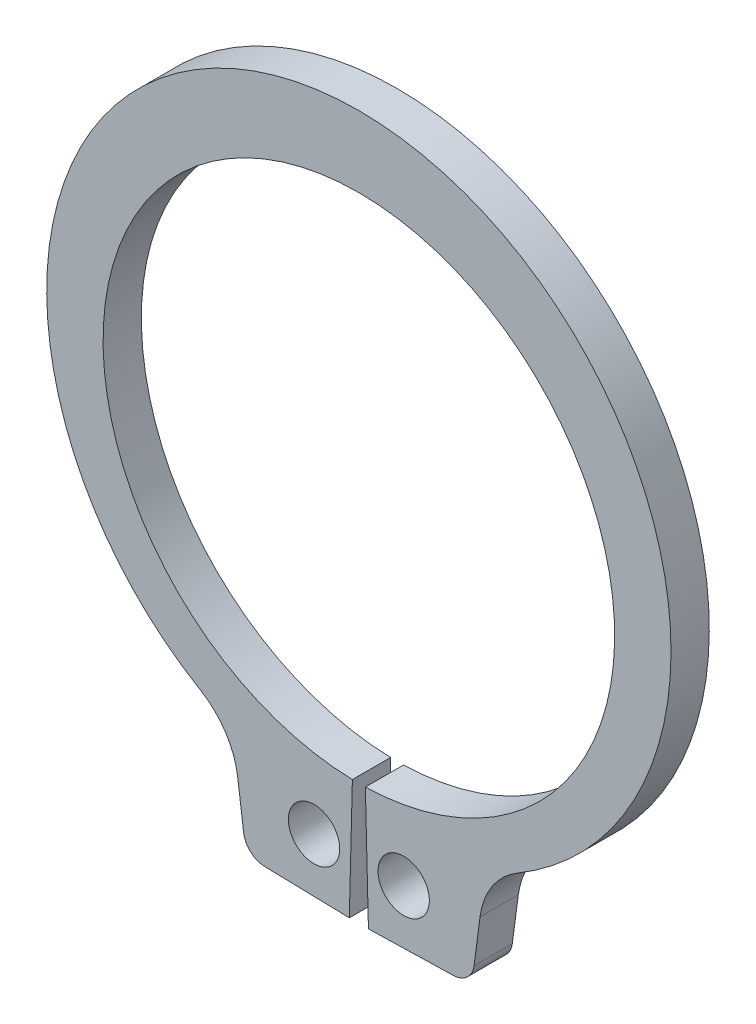
ISO-10303-21;
HEADER;
FILE_DESCRIPTION(('STEP AP214'),'2;1');
FILE_NAME('part.step','',(''),(''),'','','');
FILE_SCHEMA(('AUTOMOTIVE_DESIGN { 1 0 10303 214 1 1 1 1 }'));
ENDSEC;
DATA;
#1=APPLICATION_CONTEXT('core data for automotive mechanical design processes');
#2=APPLICATION_PROTOCOL_DEFINITION('international standard','automotive_design',2000,#1);
#3=PRODUCT_CONTEXT('',#1,'mechanical');
#4=PRODUCT('Part','Part','',(#3));
#5=PRODUCT_RELATED_PRODUCT_CATEGORY('part','',(#4));
#6=PRODUCT_DEFINITION_FORMATION('','',#4);
#7=PRODUCT_DEFINITION_CONTEXT('part definition',#1,'design');
#8=PRODUCT_DEFINITION('design','',#6,#7);
#9=PRODUCT_DEFINITION_SHAPE('','',#8);
#10=(LENGTH_UNIT() NAMED_UNIT(*) SI_UNIT(.MILLI.,.METRE.));
#11=(NAMED_UNIT(*) PLANE_ANGLE_UNIT() SI_UNIT($,.RADIAN.));
#12=(NAMED_UNIT(*) SI_UNIT($,.STERADIAN.) SOLID_ANGLE_UNIT());
#13=UNCERTAINTY_MEASURE_WITH_UNIT(LENGTH_MEASURE(1.E-05),#10,'distance_accuracy_value','');
#14=(GEOMETRIC_REPRESENTATION_CONTEXT(3) GLOBAL_UNCERTAINTY_ASSIGNED_CONTEXT((#13)) GLOBAL_UNIT_ASSIGNED_CONTEXT((#10,
#11,#12)) REPRESENTATION_CONTEXT('',''));
#15=CARTESIAN_POINT('',(0.,0.,0.));
#16=DIRECTION('',(0.,0.,1.));
#17=DIRECTION('',(1.,0.,0.));
#18=AXIS2_PLACEMENT_3D('',#15,#16,#17);
#19=CARTESIAN_POINT('',(0.,0.,-0.889));
#20=DIRECTION('',(0.,0.,1.));
#21=DIRECTION('',(1.,0.,0.));
#22=AXIS2_PLACEMENT_3D('',#19,#20,#21);
#23=CYLINDRICAL_SURFACE('',#22,5.9436);
#24=CARTESIAN_POINT('',(0.,0.,0.));
#25=DIRECTION('',(0.,0.,-1.));
#26=DIRECTION('',(1.,0.,0.));
#27=AXIS2_PLACEMENT_3D('',#24,#25,#26);
#28=CIRCLE('',#27,5.9436);
#29=CARTESIAN_POINT('',(-0.15074347826087,-5.94168809041352,0.));
#30=VERTEX_POINT('',#29);
#31=CARTESIAN_POINT('',(0.15074347826087,-5.94168809041352,0.));
#32=VERTEX_POINT('',#31);
#33=EDGE_CURVE('E151',#30,#32,#28,.T.);
#34=ORIENTED_EDGE('',*,*,#33,.F.);
#35=DIRECTION('',(0.,0.,1.));
#36=VECTOR('',#35,1.);
#37=CARTESIAN_POINT('',(-0.15074347826087,-5.94168809041352,-0.889));
#38=LINE('',#37,#36);
#39=CARTESIAN_POINT('',(-0.15074347826087,-5.94168809041352,-0.889));
#40=VERTEX_POINT('',#39);
#41=EDGE_CURVE('E11',#40,#30,#38,.T.);
#42=ORIENTED_EDGE('',*,*,#41,.F.);
#43=CARTESIAN_POINT('',(0.,0.,-0.889));
#44=DIRECTION('',(0.,0.,-1.));
#45=DIRECTION('',(1.,0.,0.));
#46=AXIS2_PLACEMENT_3D('',#43,#44,#45);
#47=CIRCLE('',#46,5.9436);
#48=CARTESIAN_POINT('',(0.15074347826087,-5.94168809041352,-0.889));
#49=VERTEX_POINT('',#48);
#50=EDGE_CURVE('E184',#40,#49,#47,.T.);
#51=ORIENTED_EDGE('',*,*,#50,.T.);
#52=DIRECTION('',(0.,0.,1.));
#53=VECTOR('',#52,1.);
#54=CARTESIAN_POINT('',(0.15074347826087,-5.94168809041352,-0.889));
#55=LINE('',#54,#53);
#56=EDGE_CURVE('E33',#49,#32,#55,.T.);
#57=ORIENTED_EDGE('',*,*,#56,.T.);
#58=EDGE_LOOP('',(#34,#42,#51,#57));
#59=FACE_BOUND('',#58,.T.);
#60=ADVANCED_FACE('F30',(#59),#23,.F.);
#61=CARTESIAN_POINT('',(-0.15074347826087,-5.94168809041352,-0.889));
#62=DIRECTION('',(0.999678324654,-0.0253623188405797,0.));
#63=DIRECTION('',(0.0253623188405797,0.999678324654,0.));
#64=AXIS2_PLACEMENT_3D('',#61,#62,#63);
#65=PLANE('',#64);
#66=DIRECTION('',(0.0253623188405797,0.999678324654,0.));
#67=VECTOR('',#66,1.);
#68=CARTESIAN_POINT('',(-0.15074347826087,-5.94168809041352,0.));
#69=LINE('',#68,#67);
#70=CARTESIAN_POINT('',(-0.22225,-8.76018115894301,0.));
#71=VERTEX_POINT('',#70);
#72=EDGE_CURVE('E182',#71,#30,#69,.T.);
#73=ORIENTED_EDGE('',*,*,#72,.F.);
#74=DIRECTION('',(0.,0.,1.));
#75=VECTOR('',#74,1.);
#76=CARTESIAN_POINT('',(-0.22225,-8.76018115894301,-0.889));
#77=LINE('',#76,#75);
#78=CARTESIAN_POINT('',(-0.22225,-8.76018115894301,-0.889));
#79=VERTEX_POINT('',#78);
#80=EDGE_CURVE('E39',#79,#71,#77,.T.);
#81=ORIENTED_EDGE('',*,*,#80,.F.);
#82=DIRECTION('',(0.0253623188405797,0.999678324654,0.));
#83=VECTOR('',#82,1.);
#84=CARTESIAN_POINT('',(-0.15074347826087,-5.94168809041352,-0.889));
#85=LINE('',#84,#83);
#86=EDGE_CURVE('E141',#79,#40,#85,.T.);
#87=ORIENTED_EDGE('',*,*,#86,.T.);
#88=ORIENTED_EDGE('',*,*,#41,.T.);
#89=EDGE_LOOP('',(#73,#81,#87,#88));
#90=FACE_BOUND('',#89,.T.);
#91=ADVANCED_FACE('F204',(#90),#65,.T.);
#92=CARTESIAN_POINT('',(-0.22225,-8.76018115894301,-0.889));
#93=DIRECTION('',(-0.0253623188405804,-0.999678324654,0.));
#94=DIRECTION('',(0.999678324654,-0.0253623188405804,0.));
#95=AXIS2_PLACEMENT_3D('',#92,#93,#94);
#96=PLANE('',#95);
#97=DIRECTION('',(0.999678324654,-0.0253623188405804,0.));
#98=VECTOR('',#97,1.);
#99=CARTESIAN_POINT('',(-0.22225,-8.76018115894301,0.));
#100=LINE('',#99,#98);
#101=CARTESIAN_POINT('',(-2.19350081150534,-8.71016957985485,0.));
#102=VERTEX_POINT('',#101);
#103=EDGE_CURVE('E128',#102,#71,#100,.T.);
#104=ORIENTED_EDGE('',*,*,#103,.F.);
#105=DIRECTION('',(0.,0.,1.));
#106=VECTOR('',#105,1.);
#107=CARTESIAN_POINT('',(-2.19350081150534,-8.71016957985485,-0.889));
#108=LINE('',#107,#106);
#109=CARTESIAN_POINT('',(-2.19350081150534,-8.71016957985485,-0.889));
#110=VERTEX_POINT('',#109);
#111=EDGE_CURVE('E123',#110,#102,#108,.T.);
#112=ORIENTED_EDGE('',*,*,#111,.F.);
#113=DIRECTION('',(0.999678324654,-0.0253623188405804,0.));
#114=VECTOR('',#113,1.);
#115=CARTESIAN_POINT('',(-0.22225,-8.76018115894301,-0.889));
#116=LINE('',#115,#114);
#117=EDGE_CURVE('E126',#110,#79,#116,.T.);
#118=ORIENTED_EDGE('',*,*,#117,.T.);
#119=ORIENTED_EDGE('',*,*,#80,.T.);
#120=EDGE_LOOP('',(#104,#112,#118,#119));
#121=FACE_BOUND('',#120,.T.);
#122=ADVANCED_FACE('F125',(#121),#96,.T.);
#123=CARTESIAN_POINT('',(-2.18081965208505,-8.21033041752785,-0.889));
#124=DIRECTION('',(0.,0.,1.));
#125=DIRECTION('',(1.,0.,0.));
#126=AXIS2_PLACEMENT_3D('',#123,#124,#125);
#127=CYLINDRICAL_SURFACE('',#126,0.5);
#128=CARTESIAN_POINT('',(-2.18081965208505,-8.21033041752785,0.));
#129=DIRECTION('',(0.,0.,1.));
#130=DIRECTION('',(1.,0.,0.));
#131=AXIS2_PLACEMENT_3D('',#128,#129,#130);
#132=CIRCLE('',#131,0.5);
#133=CARTESIAN_POINT('',(-2.67654208277196,-8.27559351363787,0.));
#134=VERTEX_POINT('',#133);
#135=EDGE_CURVE('E179',#134,#102,#132,.T.);
#136=ORIENTED_EDGE('',*,*,#135,.F.);
#137=DIRECTION('',(0.,0.,1.));
#138=VECTOR('',#137,1.);
#139=CARTESIAN_POINT('',(-2.67654208277196,-8.27559351363787,-0.889));
#140=LINE('',#139,#138);
#141=CARTESIAN_POINT('',(-2.67654208277196,-8.27559351363787,-0.889));
#142=VERTEX_POINT('',#141);
#143=EDGE_CURVE('E133',#142,#134,#140,.T.);
#144=ORIENTED_EDGE('',*,*,#143,.F.);
#145=CARTESIAN_POINT('',(-2.18081965208505,-8.21033041752785,-0.889));
#146=DIRECTION('',(0.,0.,1.));
#147=DIRECTION('',(1.,0.,0.));
#148=AXIS2_PLACEMENT_3D('',#145,#146,#147);
#149=CIRCLE('',#148,0.5);
#150=EDGE_CURVE('E139',#142,#110,#149,.T.);
#151=ORIENTED_EDGE('',*,*,#150,.T.);
#152=ORIENTED_EDGE('',*,*,#111,.T.);
#153=EDGE_LOOP('',(#136,#144,#151,#152));
#154=FACE_BOUND('',#153,.T.);
#155=ADVANCED_FACE('F143',(#154),#127,.T.);
#156=CARTESIAN_POINT('',(-2.81532005516637,-7.22147015906734,-0.889));
#157=DIRECTION('',(-0.99144486137381,-0.130526192220052,0.));
#158=DIRECTION('',(0.130526192220052,-0.99144486137381,0.));
#159=AXIS2_PLACEMENT_3D('',#156,#157,#158);
#160=PLANE('',#159);
#161=DIRECTION('',(0.130526192220052,-0.99144486137381,0.));
#162=VECTOR('',#161,1.);
#163=CARTESIAN_POINT('',(-2.81532005516637,-7.22147015906734,0.));
#164=LINE('',#163,#162);
#165=CARTESIAN_POINT('',(-2.81532005516637,-7.22147015906734,0.));
#166=VERTEX_POINT('',#165);
#167=EDGE_CURVE('E176',#166,#134,#164,.T.);
#168=ORIENTED_EDGE('',*,*,#167,.F.);
#169=DIRECTION('',(0.,0.,1.));
#170=VECTOR('',#169,1.);
#171=CARTESIAN_POINT('',(-2.81532005516637,-7.22147015906734,-0.889));
#172=LINE('',#171,#170);
#173=CARTESIAN_POINT('',(-2.81532005516637,-7.22147015906734,-0.889));
#174=VERTEX_POINT('',#173);
#175=EDGE_CURVE('E188',#174,#166,#172,.T.);
#176=ORIENTED_EDGE('',*,*,#175,.F.);
#177=DIRECTION('',(0.130526192220052,-0.99144486137381,0.));
#178=VECTOR('',#177,1.);
#179=CARTESIAN_POINT('',(-2.81532005516637,-7.22147015906734,-0.889));
#180=LINE('',#179,#178);
#181=EDGE_CURVE('E144',#174,#142,#180,.T.);
#182=ORIENTED_EDGE('',*,*,#181,.T.);
#183=ORIENTED_EDGE('',*,*,#143,.T.);
#184=EDGE_LOOP('',(#168,#176,#182,#183));
#185=FACE_BOUND('',#184,.T.);
#186=ADVANCED_FACE('F217',(#185),#160,.T.);
#187=CARTESIAN_POINT('',(-4.60285275575283,-7.45680330361869,-0.889));
#188=DIRECTION('',(0.,0.,1.));
#189=DIRECTION('',(1.,0.,0.));
#190=AXIS2_PLACEMENT_3D('',#187,#188,#189);
#191=CYLINDRICAL_SURFACE('',#190,1.80295724979555);
#192=CARTESIAN_POINT('',(-4.60285275575283,-7.45680330361869,0.));
#193=DIRECTION('',(0.,0.,-1.));
#194=DIRECTION('',(1.,0.,0.));
#195=AXIS2_PLACEMENT_3D('',#192,#193,#194);
#196=CIRCLE('',#195,1.80295724979555);
#197=CARTESIAN_POINT('',(-3.6864403239202,-5.90411431371346,0.));
#198=VERTEX_POINT('',#197);
#199=EDGE_CURVE('E173',#198,#166,#196,.T.);
#200=ORIENTED_EDGE('',*,*,#199,.F.);
#201=DIRECTION('',(0.,0.,1.));
#202=VECTOR('',#201,1.);
#203=CARTESIAN_POINT('',(-3.6864403239202,-5.90411431371346,-0.889));
#204=LINE('',#203,#202);
#205=CARTESIAN_POINT('',(-3.6864403239202,-5.90411431371346,-0.889));
#206=VERTEX_POINT('',#205);
#207=EDGE_CURVE('E190',#206,#198,#204,.T.);
#208=ORIENTED_EDGE('',*,*,#207,.F.);
#209=CARTESIAN_POINT('',(-4.60285275575283,-7.45680330361869,-0.889));
#210=DIRECTION('',(0.,0.,-1.));
#211=DIRECTION('',(1.,0.,0.));
#212=AXIS2_PLACEMENT_3D('',#209,#210,#211);
#213=CIRCLE('',#212,1.80295724979555);
#214=EDGE_CURVE('E146',#206,#174,#213,.T.);
#215=ORIENTED_EDGE('',*,*,#214,.T.);
#216=ORIENTED_EDGE('',*,*,#175,.T.);
#217=EDGE_LOOP('',(#200,#208,#215,#216));
#218=FACE_BOUND('',#217,.T.);
#219=ADVANCED_FACE('F220',(#218),#191,.F.);
#220=CARTESIAN_POINT('',(0.,0.341867412491376,-0.889));
#221=DIRECTION('',(0.,0.,1.));
#222=DIRECTION('',(1.,0.,0.));
#223=AXIS2_PLACEMENT_3D('',#220,#221,#222);
#224=CYLINDRICAL_SURFACE('',#223,7.25273258750863);
#225=CARTESIAN_POINT('',(0.,0.341867412491376,0.));
#226=DIRECTION('',(0.,0.,1.));
#227=DIRECTION('',(1.,0.,0.));
#228=AXIS2_PLACEMENT_3D('',#225,#226,#227);
#229=CIRCLE('',#228,7.25273258750863);
#230=CARTESIAN_POINT('',(3.6864403239202,-5.90411431371346,0.));
#231=VERTEX_POINT('',#230);
#232=EDGE_CURVE('E170',#231,#198,#229,.T.);
#233=ORIENTED_EDGE('',*,*,#232,.F.);
#234=DIRECTION('',(0.,0.,1.));
#235=VECTOR('',#234,1.);
#236=CARTESIAN_POINT('',(3.6864403239202,-5.90411431371346,-0.889));
#237=LINE('',#236,#235);
#238=CARTESIAN_POINT('',(3.6864403239202,-5.90411431371346,-0.889));
#239=VERTEX_POINT('',#238);
#240=EDGE_CURVE('E192',#239,#231,#237,.T.);
#241=ORIENTED_EDGE('',*,*,#240,.F.);
#242=CARTESIAN_POINT('',(0.,0.341867412491376,-0.889));
#243=DIRECTION('',(0.,0.,1.));
#244=DIRECTION('',(1.,0.,0.));
#245=AXIS2_PLACEMENT_3D('',#242,#243,#244);
#246=CIRCLE('',#245,7.25273258750863);
#247=EDGE_CURVE('E294',#239,#206,#246,.T.);
#248=ORIENTED_EDGE('',*,*,#247,.T.);
#249=ORIENTED_EDGE('',*,*,#207,.T.);
#250=EDGE_LOOP('',(#233,#241,#248,#249));
#251=FACE_BOUND('',#250,.T.);
#252=ADVANCED_FACE('F224',(#251),#224,.T.);
#253=CARTESIAN_POINT('',(4.60285275575283,-7.45680330361869,-0.889));
#254=DIRECTION('',(0.,0.,1.));
#255=DIRECTION('',(1.,0.,0.));
#256=AXIS2_PLACEMENT_3D('',#253,#254,#255);
#257=CYLINDRICAL_SURFACE('',#256,1.80295724979555);
#258=CARTESIAN_POINT('',(4.60285275575283,-7.45680330361869,0.));
#259=DIRECTION('',(0.,0.,-1.));
#260=DIRECTION('',(1.,0.,0.));
#261=AXIS2_PLACEMENT_3D('',#258,#259,#260);
#262=CIRCLE('',#261,1.80295724979555);
#263=CARTESIAN_POINT('',(2.81532005516637,-7.22147015906734,0.));
#264=VERTEX_POINT('',#263);
#265=EDGE_CURVE('E167',#264,#231,#262,.T.);
#266=ORIENTED_EDGE('',*,*,#265,.F.);
#267=DIRECTION('',(0.,0.,1.));
#268=VECTOR('',#267,1.);
#269=CARTESIAN_POINT('',(2.81532005516637,-7.22147015906734,-0.889));
#270=LINE('',#269,#268);
#271=CARTESIAN_POINT('',(2.81532005516637,-7.22147015906734,-0.889));
#272=VERTEX_POINT('',#271);
#273=EDGE_CURVE('E194',#272,#264,#270,.T.);
#274=ORIENTED_EDGE('',*,*,#273,.F.);
#275=CARTESIAN_POINT('',(4.60285275575283,-7.45680330361869,-0.889));
#276=DIRECTION('',(0.,0.,-1.));
#277=DIRECTION('',(1.,0.,0.));
#278=AXIS2_PLACEMENT_3D('',#275,#276,#277);
#279=CIRCLE('',#278,1.80295724979555);
#280=EDGE_CURVE('E291',#272,#239,#279,.T.);
#281=ORIENTED_EDGE('',*,*,#280,.T.);
#282=ORIENTED_EDGE('',*,*,#240,.T.);
#283=EDGE_LOOP('',(#266,#274,#281,#282));
#284=FACE_BOUND('',#283,.T.);
#285=ADVANCED_FACE('F228',(#284),#257,.F.);
#286=CARTESIAN_POINT('',(2.81532005516637,-7.22147015906734,-0.889));
#287=DIRECTION('',(0.99144486137381,-0.130526192220052,0.));
#288=DIRECTION('',(0.130526192220052,0.99144486137381,0.));
#289=AXIS2_PLACEMENT_3D('',#286,#287,#288);
#290=PLANE('',#289);
#291=DIRECTION('',(0.130526192220052,0.99144486137381,0.));
#292=VECTOR('',#291,1.);
#293=CARTESIAN_POINT('',(2.81532005516637,-7.22147015906734,0.));
#294=LINE('',#293,#292);
#295=CARTESIAN_POINT('',(2.67654208277196,-8.27559351363787,0.));
#296=VERTEX_POINT('',#295);
#297=EDGE_CURVE('E164',#296,#264,#294,.T.);
#298=ORIENTED_EDGE('',*,*,#297,.F.);
#299=DIRECTION('',(0.,0.,1.));
#300=VECTOR('',#299,1.);
#301=CARTESIAN_POINT('',(2.67654208277196,-8.27559351363787,-0.889));
#302=LINE('',#301,#300);
#303=CARTESIAN_POINT('',(2.67654208277196,-8.27559351363787,-0.889));
#304=VERTEX_POINT('',#303);
#305=EDGE_CURVE('E196',#304,#296,#302,.T.);
#306=ORIENTED_EDGE('',*,*,#305,.F.);
#307=DIRECTION('',(0.130526192220052,0.99144486137381,0.));
#308=VECTOR('',#307,1.);
#309=CARTESIAN_POINT('',(2.81532005516637,-7.22147015906734,-0.889));
#310=LINE('',#309,#308);
#311=EDGE_CURVE('E288',#304,#272,#310,.T.);
#312=ORIENTED_EDGE('',*,*,#311,.T.);
#313=ORIENTED_EDGE('',*,*,#273,.T.);
#314=EDGE_LOOP('',(#298,#306,#312,#313));
#315=FACE_BOUND('',#314,.T.);
#316=ADVANCED_FACE('F232',(#315),#290,.T.);
#317=CARTESIAN_POINT('',(2.18081965208505,-8.21033041752785,-0.889));
#318=DIRECTION('',(0.,0.,1.));
#319=DIRECTION('',(1.,0.,0.));
#320=AXIS2_PLACEMENT_3D('',#317,#318,#319);
#321=CYLINDRICAL_SURFACE('',#320,0.5);
#322=CARTESIAN_POINT('',(2.18081965208505,-8.21033041752785,0.));
#323=DIRECTION('',(0.,0.,1.));
#324=DIRECTION('',(-1.,0.,0.));
#325=AXIS2_PLACEMENT_3D('',#322,#323,#324);
#326=CIRCLE('',#325,0.5);
#327=CARTESIAN_POINT('',(2.19350081150534,-8.71016957985485,0.));
#328=VERTEX_POINT('',#327);
#329=EDGE_CURVE('E161',#328,#296,#326,.T.);
#330=ORIENTED_EDGE('',*,*,#329,.F.);
#331=DIRECTION('',(0.,0.,1.));
#332=VECTOR('',#331,1.);
#333=CARTESIAN_POINT('',(2.19350081150534,-8.71016957985485,-0.889));
#334=LINE('',#333,#332);
#335=CARTESIAN_POINT('',(2.19350081150534,-8.71016957985485,-0.889));
#336=VERTEX_POINT('',#335);
#337=EDGE_CURVE('E198',#336,#328,#334,.T.);
#338=ORIENTED_EDGE('',*,*,#337,.F.);
#339=CARTESIAN_POINT('',(2.18081965208505,-8.21033041752785,-0.889));
#340=DIRECTION('',(0.,0.,1.));
#341=DIRECTION('',(-1.,0.,0.));
#342=AXIS2_PLACEMENT_3D('',#339,#340,#341);
#343=CIRCLE('',#342,0.5);
#344=EDGE_CURVE('E285',#336,#304,#343,.T.);
#345=ORIENTED_EDGE('',*,*,#344,.T.);
#346=ORIENTED_EDGE('',*,*,#305,.T.);
#347=EDGE_LOOP('',(#330,#338,#345,#346));
#348=FACE_BOUND('',#347,.T.);
#349=ADVANCED_FACE('F236',(#348),#321,.T.);
#350=CARTESIAN_POINT('',(0.22225,-8.76018115894301,-0.889));
#351=DIRECTION('',(0.0253623188405804,-0.999678324654,0.));
#352=DIRECTION('',(0.999678324654,0.0253623188405804,0.));
#353=AXIS2_PLACEMENT_3D('',#350,#351,#352);
#354=PLANE('',#353);
#355=DIRECTION('',(0.999678324654,0.0253623188405804,0.));
#356=VECTOR('',#355,1.);
#357=CARTESIAN_POINT('',(0.22225,-8.76018115894301,0.));
#358=LINE('',#357,#356);
#359=CARTESIAN_POINT('',(0.22225,-8.76018115894301,0.));
#360=VERTEX_POINT('',#359);
#361=EDGE_CURVE('E158',#360,#328,#358,.T.);
#362=ORIENTED_EDGE('',*,*,#361,.F.);
#363=DIRECTION('',(0.,0.,1.));
#364=VECTOR('',#363,1.);
#365=CARTESIAN_POINT('',(0.22225,-8.76018115894301,-0.889));
#366=LINE('',#365,#364);
#367=CARTESIAN_POINT('',(0.22225,-8.76018115894301,-0.889));
#368=VERTEX_POINT('',#367);
#369=EDGE_CURVE('E199',#368,#360,#366,.T.);
#370=ORIENTED_EDGE('',*,*,#369,.F.);
#371=DIRECTION('',(0.999678324654,0.0253623188405804,0.));
#372=VECTOR('',#371,1.);
#373=CARTESIAN_POINT('',(0.22225,-8.76018115894301,-0.889));
#374=LINE('',#373,#372);
#375=EDGE_CURVE('E282',#368,#336,#374,.T.);
#376=ORIENTED_EDGE('',*,*,#375,.T.);
#377=ORIENTED_EDGE('',*,*,#337,.T.);
#378=EDGE_LOOP('',(#362,#370,#376,#377));
#379=FACE_BOUND('',#378,.T.);
#380=ADVANCED_FACE('F240',(#379),#354,.T.);
#381=CARTESIAN_POINT('',(0.15074347826087,-5.94168809041352,-0.889));
#382=DIRECTION('',(-0.999678324654,-0.0253623188405797,0.));
#383=DIRECTION('',(0.0253623188405797,-0.999678324654,0.));
#384=AXIS2_PLACEMENT_3D('',#381,#382,#383);
#385=PLANE('',#384);
#386=DIRECTION('',(0.0253623188405797,-0.999678324654,0.));
#387=VECTOR('',#386,1.);
#388=CARTESIAN_POINT('',(0.15074347826087,-5.94168809041352,0.));
#389=LINE('',#388,#387);
#390=EDGE_CURVE('E154',#32,#360,#389,.T.);
#391=ORIENTED_EDGE('',*,*,#390,.F.);
#392=ORIENTED_EDGE('',*,*,#56,.F.);
#393=DIRECTION('',(0.0253623188405797,-0.999678324654,0.));
#394=VECTOR('',#393,1.);
#395=CARTESIAN_POINT('',(0.15074347826087,-5.94168809041352,-0.889));
#396=LINE('',#395,#394);
#397=EDGE_CURVE('E280',#49,#368,#396,.T.);
#398=ORIENTED_EDGE('',*,*,#397,.T.);
#399=ORIENTED_EDGE('',*,*,#369,.T.);
#400=EDGE_LOOP('',(#391,#392,#398,#399));
#401=FACE_BOUND('',#400,.T.);
#402=ADVANCED_FACE('F201',(#401),#385,.T.);
#403=CARTESIAN_POINT('',(0.,0.,-0.889));
#404=DIRECTION('',(0.,0.,1.));
#405=DIRECTION('',(1.,0.,0.));
#406=AXIS2_PLACEMENT_3D('',#403,#404,#405);
#407=PLANE('',#406);
#408=CARTESIAN_POINT('',(-1.0414,-7.48439565295689,-0.889));
#409=DIRECTION('',(0.,0.,1.));
#410=DIRECTION('',(1.,0.,0.));
#411=AXIS2_PLACEMENT_3D('',#408,#409,#410);
#412=CIRCLE('',#411,0.5969);
#413=CARTESIAN_POINT('',(-0.4445,-7.48439565295689,-0.889));
#414=VERTEX_POINT('',#413);
#415=EDGE_CURVE('E267',#414,#414,#412,.T.);
#416=ORIENTED_EDGE('',*,*,#415,.T.);
#417=EDGE_LOOP('',(#416));
#418=FACE_BOUND('',#417,.T.);
#419=CARTESIAN_POINT('',(1.0414,-7.48439565295689,-0.889));
#420=DIRECTION('',(0.,0.,1.));
#421=DIRECTION('',(1.,0.,0.));
#422=AXIS2_PLACEMENT_3D('',#419,#420,#421);
#423=CIRCLE('',#422,0.5969);
#424=CARTESIAN_POINT('',(1.6383,-7.48439565295689,-0.889));
#425=VERTEX_POINT('',#424);
#426=EDGE_CURVE('E155',#425,#425,#423,.T.);
#427=ORIENTED_EDGE('',*,*,#426,.T.);
#428=EDGE_LOOP('',(#427));
#429=FACE_BOUND('',#428,.T.);
#430=ORIENTED_EDGE('',*,*,#50,.F.);
#431=ORIENTED_EDGE('',*,*,#86,.F.);
#432=ORIENTED_EDGE('',*,*,#117,.F.);
#433=ORIENTED_EDGE('',*,*,#150,.F.);
#434=ORIENTED_EDGE('',*,*,#181,.F.);
#435=ORIENTED_EDGE('',*,*,#214,.F.);
#436=ORIENTED_EDGE('',*,*,#247,.F.);
#437=ORIENTED_EDGE('',*,*,#280,.F.);
#438=ORIENTED_EDGE('',*,*,#311,.F.);
#439=ORIENTED_EDGE('',*,*,#344,.F.);
#440=ORIENTED_EDGE('',*,*,#375,.F.);
#441=ORIENTED_EDGE('',*,*,#397,.F.);
#442=EDGE_LOOP('',(#430,#431,#432,#433,#434,#435,#436,#437,#438,#439,#440,#441));
#443=FACE_BOUND('',#442,.T.);
#444=ADVANCED_FACE('F137',(#418,#429,#443),#407,.F.);
#445=CARTESIAN_POINT('',(0.,0.,0.));
#446=DIRECTION('',(0.,0.,1.));
#447=DIRECTION('',(1.,0.,0.));
#448=AXIS2_PLACEMENT_3D('',#445,#446,#447);
#449=PLANE('',#448);
#450=CARTESIAN_POINT('',(-1.0414,-7.48439565295689,0.));
#451=DIRECTION('',(0.,0.,1.));
#452=DIRECTION('',(1.,0.,0.));
#453=AXIS2_PLACEMENT_3D('',#450,#451,#452);
#454=CIRCLE('',#453,0.5969);
#455=CARTESIAN_POINT('',(-0.4445,-7.48439565295689,0.));
#456=VERTEX_POINT('',#455);
#457=EDGE_CURVE('E270',#456,#456,#454,.T.);
#458=ORIENTED_EDGE('',*,*,#457,.F.);
#459=EDGE_LOOP('',(#458));
#460=FACE_BOUND('',#459,.T.);
#461=CARTESIAN_POINT('',(1.0414,-7.48439565295689,0.));
#462=DIRECTION('',(0.,0.,1.));
#463=DIRECTION('',(1.,0.,0.));
#464=AXIS2_PLACEMENT_3D('',#461,#462,#463);
#465=CIRCLE('',#464,0.5969);
#466=CARTESIAN_POINT('',(1.6383,-7.48439565295689,0.));
#467=VERTEX_POINT('',#466);
#468=EDGE_CURVE('E272',#467,#467,#465,.T.);
#469=ORIENTED_EDGE('',*,*,#468,.F.);
#470=EDGE_LOOP('',(#469));
#471=FACE_BOUND('',#470,.T.);
#472=ORIENTED_EDGE('',*,*,#33,.T.);
#473=ORIENTED_EDGE('',*,*,#390,.T.);
#474=ORIENTED_EDGE('',*,*,#361,.T.);
#475=ORIENTED_EDGE('',*,*,#329,.T.);
#476=ORIENTED_EDGE('',*,*,#297,.T.);
#477=ORIENTED_EDGE('',*,*,#265,.T.);
#478=ORIENTED_EDGE('',*,*,#232,.T.);
#479=ORIENTED_EDGE('',*,*,#199,.T.);
#480=ORIENTED_EDGE('',*,*,#167,.T.);
#481=ORIENTED_EDGE('',*,*,#135,.T.);
#482=ORIENTED_EDGE('',*,*,#103,.T.);
#483=ORIENTED_EDGE('',*,*,#72,.T.);
#484=EDGE_LOOP('',(#472,#473,#474,#475,#476,#477,#478,#479,#480,#481,#482,#483));
#485=FACE_BOUND('',#484,.T.);
#486=ADVANCED_FACE('F203',(#460,#471,#485),#449,.T.);
#487=CARTESIAN_POINT('',(1.0414,-7.48439565295689,-0.889));
#488=DIRECTION('',(0.,0.,1.));
#489=DIRECTION('',(1.,0.,0.));
#490=AXIS2_PLACEMENT_3D('',#487,#488,#489);
#491=CYLINDRICAL_SURFACE('',#490,0.5969);
#492=ORIENTED_EDGE('',*,*,#426,.F.);
#493=EDGE_LOOP('',(#492));
#494=FACE_BOUND('',#493,.T.);
#495=ORIENTED_EDGE('',*,*,#468,.T.);
#496=EDGE_LOOP('',(#495));
#497=FACE_BOUND('',#496,.T.);
#498=ADVANCED_FACE('F252',(#494,#497),#491,.F.);
#499=CARTESIAN_POINT('',(-1.0414,-7.48439565295689,-0.889));
#500=DIRECTION('',(0.,0.,1.));
#501=DIRECTION('',(1.,0.,0.));
#502=AXIS2_PLACEMENT_3D('',#499,#500,#501);
#503=CYLINDRICAL_SURFACE('',#502,0.5969);
#504=ORIENTED_EDGE('',*,*,#415,.F.);
#505=EDGE_LOOP('',(#504));
#506=FACE_BOUND('',#505,.T.);
#507=ORIENTED_EDGE('',*,*,#457,.T.);
#508=EDGE_LOOP('',(#507));
#509=FACE_BOUND('',#508,.T.);
#510=ADVANCED_FACE('F259',(#506,#509),#503,.F.);
#511=CLOSED_SHELL('',(#60,#91,#122,#155,#186,#219,#252,#285,#316,#349,#380,#402,#444,#486,#498,#510));
#512=MANIFOLD_SOLID_BREP('B2',#511);
#513=ADVANCED_BREP_SHAPE_REPRESENTATION('',(#18,#512),#14);
#514=SHAPE_DEFINITION_REPRESENTATION(#9,#513);
ENDSEC;
END-ISO-10303-21;
